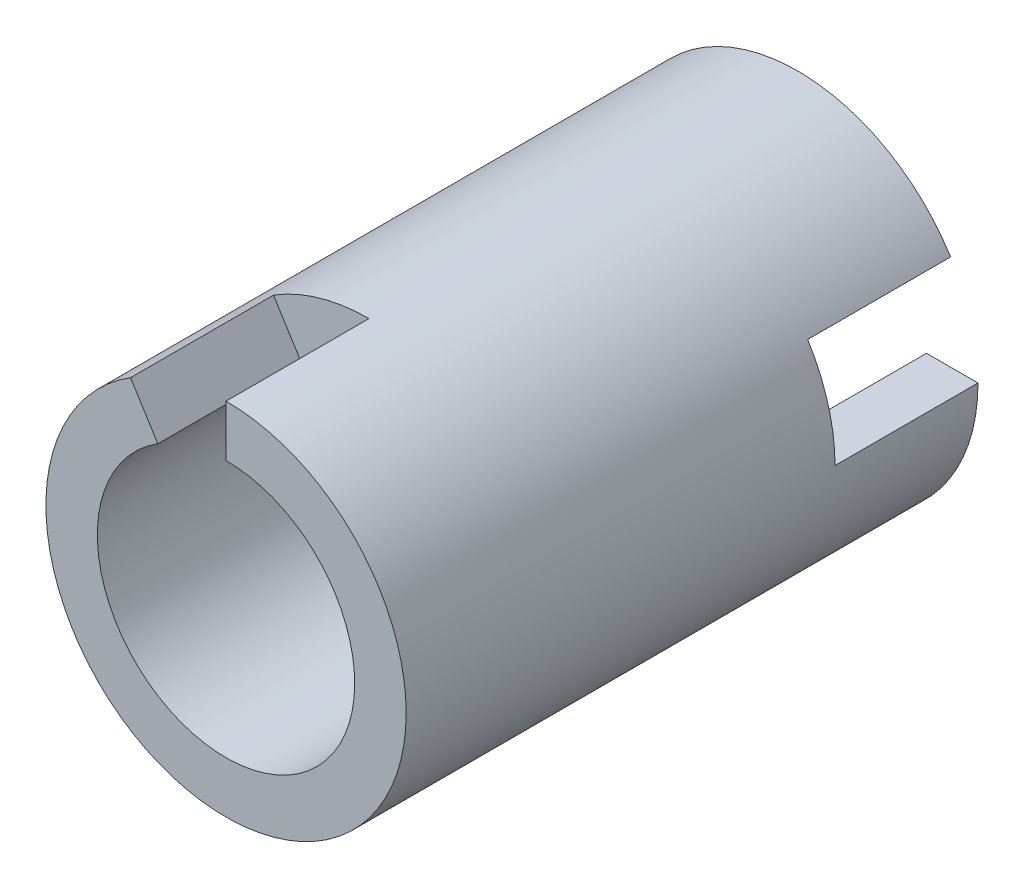
ISO-10303-21;
HEADER;
FILE_DESCRIPTION(('STEP AP214'),'2;1');
FILE_NAME('part.step','',(''),(''),'','','');
FILE_SCHEMA(('AUTOMOTIVE_DESIGN { 1 0 10303 214 1 1 1 1 }'));
ENDSEC;
DATA;
#1=APPLICATION_CONTEXT('core data for automotive mechanical design processes');
#2=APPLICATION_PROTOCOL_DEFINITION('international standard','automotive_design',2000,#1);
#3=PRODUCT_CONTEXT('',#1,'mechanical');
#4=PRODUCT('Part','Part','',(#3));
#5=PRODUCT_RELATED_PRODUCT_CATEGORY('part','',(#4));
#6=PRODUCT_DEFINITION_FORMATION('','',#4);
#7=PRODUCT_DEFINITION_CONTEXT('part definition',#1,'design');
#8=PRODUCT_DEFINITION('design','',#6,#7);
#9=PRODUCT_DEFINITION_SHAPE('','',#8);
#10=(LENGTH_UNIT() NAMED_UNIT(*) SI_UNIT(.MILLI.,.METRE.));
#11=(NAMED_UNIT(*) PLANE_ANGLE_UNIT() SI_UNIT($,.RADIAN.));
#12=(NAMED_UNIT(*) SI_UNIT($,.STERADIAN.) SOLID_ANGLE_UNIT());
#13=UNCERTAINTY_MEASURE_WITH_UNIT(LENGTH_MEASURE(1.E-05),#10,'distance_accuracy_value','');
#14=(GEOMETRIC_REPRESENTATION_CONTEXT(3) GLOBAL_UNCERTAINTY_ASSIGNED_CONTEXT((#13)) GLOBAL_UNIT_ASSIGNED_CONTEXT((#10,
#11,#12)) REPRESENTATION_CONTEXT('',''));
#15=CARTESIAN_POINT('',(0.,0.,0.));
#16=DIRECTION('',(0.,0.,1.));
#17=DIRECTION('',(1.,0.,0.));
#18=AXIS2_PLACEMENT_3D('',#15,#16,#17);
#19=CARTESIAN_POINT('',(0.,0.,-10.));
#20=DIRECTION('',(0.,0.,1.));
#21=DIRECTION('',(1.,0.,0.));
#22=AXIS2_PLACEMENT_3D('',#19,#20,#21);
#23=PLANE('',#22);
#24=DIRECTION('',(-0.848048096156435,-0.529919264233191,0.));
#25=VECTOR('',#24,1.);
#26=CARTESIAN_POINT('',(9.97014890227406,6.23004048300326,-10.));
#27=LINE('',#26,#25);
#28=CARTESIAN_POINT('',(5.34270300578554,3.3384913646691,-10.));
#29=VERTEX_POINT('',#28);
#30=CARTESIAN_POINT('',(3.81621643270396,2.38463668904936,-10.));
#31=VERTEX_POINT('',#30);
#32=EDGE_CURVE('E96',#29,#31,#27,.T.);
#33=ORIENTED_EDGE('',*,*,#32,.T.);
#34=CARTESIAN_POINT('',(0.,0.,-10.));
#35=DIRECTION('',(0.,0.,1.));
#36=DIRECTION('',(1.,0.,0.));
#37=AXIS2_PLACEMENT_3D('',#34,#35,#36);
#38=CIRCLE('',#37,4.5);
#39=CARTESIAN_POINT('',(4.5,0.,-10.));
#40=VERTEX_POINT('',#39);
#41=EDGE_CURVE('E138',#31,#40,#38,.T.);
#42=ORIENTED_EDGE('',*,*,#41,.T.);
#43=DIRECTION('',(1.,0.,0.));
#44=VECTOR('',#43,1.);
#45=CARTESIAN_POINT('',(0.,0.,-10.));
#46=LINE('',#45,#44);
#47=CARTESIAN_POINT('',(6.3,0.,-10.));
#48=VERTEX_POINT('',#47);
#49=EDGE_CURVE('E105',#40,#48,#46,.T.);
#50=ORIENTED_EDGE('',*,*,#49,.T.);
#51=CARTESIAN_POINT('',(0.,0.,-10.));
#52=DIRECTION('',(0.,0.,1.));
#53=DIRECTION('',(1.,0.,0.));
#54=AXIS2_PLACEMENT_3D('',#51,#52,#53);
#55=CIRCLE('',#54,6.3);
#56=EDGE_CURVE('E111',#29,#48,#55,.T.);
#57=ORIENTED_EDGE('',*,*,#56,.F.);
#58=EDGE_LOOP('',(#33,#42,#50,#57));
#59=FACE_BOUND('',#58,.T.);
#60=ADVANCED_FACE('F33',(#59),#23,.F.);
#61=CARTESIAN_POINT('',(0.,0.,-10.));
#62=DIRECTION('',(0.,0.,1.));
#63=DIRECTION('',(1.,0.,0.));
#64=AXIS2_PLACEMENT_3D('',#61,#62,#63);
#65=CYLINDRICAL_SURFACE('',#64,4.5);
#66=CARTESIAN_POINT('',(0.,0.,10.));
#67=DIRECTION('',(0.,0.,1.));
#68=DIRECTION('',(1.,0.,0.));
#69=AXIS2_PLACEMENT_3D('',#66,#67,#68);
#70=CIRCLE('',#69,4.5);
#71=CARTESIAN_POINT('',(-2.3846366890494,3.81621643270393,10.));
#72=VERTEX_POINT('',#71);
#73=CARTESIAN_POINT('',(0.,4.5,10.));
#74=VERTEX_POINT('',#73);
#75=EDGE_CURVE('E135',#72,#74,#70,.T.);
#76=ORIENTED_EDGE('',*,*,#75,.T.);
#77=DIRECTION('',(0.,0.,1.));
#78=VECTOR('',#77,1.);
#79=CARTESIAN_POINT('',(0.,4.5,-10.));
#80=LINE('',#79,#78);
#81=CARTESIAN_POINT('',(0.,4.5,5.));
#82=VERTEX_POINT('',#81);
#83=EDGE_CURVE('E132',#74,#82,#80,.F.);
#84=ORIENTED_EDGE('',*,*,#83,.T.);
#85=CARTESIAN_POINT('',(0.,0.,5.));
#86=DIRECTION('',(0.,0.,1.));
#87=DIRECTION('',(1.,0.,0.));
#88=AXIS2_PLACEMENT_3D('',#85,#86,#87);
#89=CIRCLE('',#88,4.5);
#90=CARTESIAN_POINT('',(-2.3846366890494,3.81621643270393,5.));
#91=VERTEX_POINT('',#90);
#92=EDGE_CURVE('E145',#91,#82,#89,.F.);
#93=ORIENTED_EDGE('',*,*,#92,.F.);
#94=DIRECTION('',(0.,0.,1.));
#95=VECTOR('',#94,1.);
#96=CARTESIAN_POINT('',(-2.3846366890494,3.81621643270393,-10.));
#97=LINE('',#96,#95);
#98=EDGE_CURVE('E129',#91,#72,#97,.T.);
#99=ORIENTED_EDGE('',*,*,#98,.T.);
#100=EDGE_LOOP('',(#76,#84,#93,#99));
#101=FACE_BOUND('',#100,.T.);
#102=DIRECTION('',(0.,0.,1.));
#103=VECTOR('',#102,1.);
#104=CARTESIAN_POINT('',(3.81621643270396,2.38463668904936,-10.));
#105=LINE('',#104,#103);
#106=CARTESIAN_POINT('',(3.81621643270396,2.38463668904936,-5.));
#107=VERTEX_POINT('',#106);
#108=EDGE_CURVE('E100',#107,#31,#105,.F.);
#109=ORIENTED_EDGE('',*,*,#108,.F.);
#110=CARTESIAN_POINT('',(0.,0.,-5.));
#111=DIRECTION('',(0.,0.,1.));
#112=DIRECTION('',(1.,0.,0.));
#113=AXIS2_PLACEMENT_3D('',#110,#111,#112);
#114=CIRCLE('',#113,4.5);
#115=CARTESIAN_POINT('',(4.5,0.,-5.));
#116=VERTEX_POINT('',#115);
#117=EDGE_CURVE('E157',#107,#116,#114,.F.);
#118=ORIENTED_EDGE('',*,*,#117,.T.);
#119=DIRECTION('',(0.,0.,1.));
#120=VECTOR('',#119,1.);
#121=CARTESIAN_POINT('',(4.5,0.,-10.));
#122=LINE('',#121,#120);
#123=EDGE_CURVE('E155',#40,#116,#122,.T.);
#124=ORIENTED_EDGE('',*,*,#123,.F.);
#125=ORIENTED_EDGE('',*,*,#41,.F.);
#126=EDGE_LOOP('',(#109,#118,#124,#125));
#127=FACE_BOUND('',#126,.T.);
#128=ADVANCED_FACE('F163',(#101,#127),#65,.F.);
#129=CARTESIAN_POINT('',(0.,0.,-10.));
#130=DIRECTION('',(0.,0.,1.));
#131=DIRECTION('',(1.,0.,0.));
#132=AXIS2_PLACEMENT_3D('',#129,#130,#131);
#133=CYLINDRICAL_SURFACE('',#132,6.3);
#134=DIRECTION('',(0.,0.,1.));
#135=VECTOR('',#134,1.);
#136=CARTESIAN_POINT('',(0.,6.3,-10.));
#137=LINE('',#136,#135);
#138=CARTESIAN_POINT('',(0.,6.3,5.));
#139=VERTEX_POINT('',#138);
#140=CARTESIAN_POINT('',(0.,6.3,10.));
#141=VERTEX_POINT('',#140);
#142=EDGE_CURVE('E117',#139,#141,#137,.T.);
#143=ORIENTED_EDGE('',*,*,#142,.T.);
#144=CARTESIAN_POINT('',(0.,0.,10.));
#145=DIRECTION('',(0.,0.,1.));
#146=DIRECTION('',(1.,0.,0.));
#147=AXIS2_PLACEMENT_3D('',#144,#145,#146);
#148=CIRCLE('',#147,6.3);
#149=CARTESIAN_POINT('',(-3.33849136466916,5.3427030057855,10.));
#150=VERTEX_POINT('',#149);
#151=EDGE_CURVE('E55',#150,#141,#148,.T.);
#152=ORIENTED_EDGE('',*,*,#151,.F.);
#153=DIRECTION('',(0.,0.,1.));
#154=VECTOR('',#153,1.);
#155=CARTESIAN_POINT('',(-3.33849136466916,5.3427030057855,-10.));
#156=LINE('',#155,#154);
#157=CARTESIAN_POINT('',(-3.33849136466916,5.3427030057855,5.));
#158=VERTEX_POINT('',#157);
#159=EDGE_CURVE('E147',#150,#158,#156,.F.);
#160=ORIENTED_EDGE('',*,*,#159,.T.);
#161=CARTESIAN_POINT('',(0.,0.,5.));
#162=DIRECTION('',(0.,0.,1.));
#163=DIRECTION('',(1.,0.,0.));
#164=AXIS2_PLACEMENT_3D('',#161,#162,#163);
#165=CIRCLE('',#164,6.3);
#166=EDGE_CURVE('E114',#139,#158,#165,.T.);
#167=ORIENTED_EDGE('',*,*,#166,.F.);
#168=EDGE_LOOP('',(#143,#152,#160,#167));
#169=FACE_BOUND('',#168,.T.);
#170=CARTESIAN_POINT('',(0.,0.,-5.));
#171=DIRECTION('',(0.,0.,1.));
#172=DIRECTION('',(1.,0.,0.));
#173=AXIS2_PLACEMENT_3D('',#170,#171,#172);
#174=CIRCLE('',#173,6.3);
#175=CARTESIAN_POINT('',(5.34270300578554,3.3384913646691,-5.));
#176=VERTEX_POINT('',#175);
#177=CARTESIAN_POINT('',(6.3,0.,-5.));
#178=VERTEX_POINT('',#177);
#179=EDGE_CURVE('E112',#176,#178,#174,.F.);
#180=ORIENTED_EDGE('',*,*,#179,.F.);
#181=DIRECTION('',(0.,0.,1.));
#182=VECTOR('',#181,1.);
#183=CARTESIAN_POINT('',(5.34270300578554,3.3384913646691,-10.));
#184=LINE('',#183,#182);
#185=EDGE_CURVE('E11',#176,#29,#184,.F.);
#186=ORIENTED_EDGE('',*,*,#185,.T.);
#187=ORIENTED_EDGE('',*,*,#56,.T.);
#188=DIRECTION('',(0.,0.,1.));
#189=VECTOR('',#188,1.);
#190=CARTESIAN_POINT('',(6.3,0.,-10.));
#191=LINE('',#190,#189);
#192=EDGE_CURVE('E40',#48,#178,#191,.T.);
#193=ORIENTED_EDGE('',*,*,#192,.T.);
#194=EDGE_LOOP('',(#180,#186,#187,#193));
#195=FACE_BOUND('',#194,.T.);
#196=ADVANCED_FACE('F109',(#169,#195),#133,.T.);
#197=CARTESIAN_POINT('',(0.,0.,10.));
#198=DIRECTION('',(0.,0.,1.));
#199=DIRECTION('',(1.,0.,0.));
#200=AXIS2_PLACEMENT_3D('',#197,#198,#199);
#201=PLANE('',#200);
#202=DIRECTION('',(0.5299192642332,-0.848048096156429,0.));
#203=VECTOR('',#202,1.);
#204=CARTESIAN_POINT('',(0.,0.,10.));
#205=LINE('',#204,#203);
#206=EDGE_CURVE('E140',#150,#72,#205,.T.);
#207=ORIENTED_EDGE('',*,*,#206,.F.);
#208=ORIENTED_EDGE('',*,*,#151,.T.);
#209=DIRECTION('',(0.,1.,0.));
#210=VECTOR('',#209,1.);
#211=CARTESIAN_POINT('',(0.,0.,10.));
#212=LINE('',#211,#210);
#213=EDGE_CURVE('E142',#74,#141,#212,.T.);
#214=ORIENTED_EDGE('',*,*,#213,.F.);
#215=ORIENTED_EDGE('',*,*,#75,.F.);
#216=EDGE_LOOP('',(#207,#208,#214,#215));
#217=FACE_BOUND('',#216,.T.);
#218=ADVANCED_FACE('F179',(#217),#201,.T.);
#219=CARTESIAN_POINT('',(0.,0.,5.));
#220=DIRECTION('',(0.,0.,1.));
#221=DIRECTION('',(1.,0.,0.));
#222=AXIS2_PLACEMENT_3D('',#219,#220,#221);
#223=PLANE('',#222);
#224=DIRECTION('',(0.,1.,0.));
#225=VECTOR('',#224,1.);
#226=CARTESIAN_POINT('',(0.,0.,5.));
#227=LINE('',#226,#225);
#228=EDGE_CURVE('E126',#82,#139,#227,.T.);
#229=ORIENTED_EDGE('',*,*,#228,.T.);
#230=ORIENTED_EDGE('',*,*,#166,.T.);
#231=DIRECTION('',(0.5299192642332,-0.848048096156429,0.));
#232=VECTOR('',#231,1.);
#233=CARTESIAN_POINT('',(-6.23004048300337,9.970148902274,5.));
#234=LINE('',#233,#232);
#235=EDGE_CURVE('E124',#158,#91,#234,.T.);
#236=ORIENTED_EDGE('',*,*,#235,.T.);
#237=ORIENTED_EDGE('',*,*,#92,.T.);
#238=EDGE_LOOP('',(#229,#230,#236,#237));
#239=FACE_BOUND('',#238,.T.);
#240=ADVANCED_FACE('F184',(#239),#223,.T.);
#241=CARTESIAN_POINT('',(0.,0.,5.));
#242=DIRECTION('',(1.,0.,0.));
#243=DIRECTION('',(0.,0.,-1.));
#244=AXIS2_PLACEMENT_3D('',#241,#242,#243);
#245=PLANE('',#244);
#246=ORIENTED_EDGE('',*,*,#142,.F.);
#247=ORIENTED_EDGE('',*,*,#228,.F.);
#248=ORIENTED_EDGE('',*,*,#83,.F.);
#249=ORIENTED_EDGE('',*,*,#213,.T.);
#250=EDGE_LOOP('',(#246,#247,#248,#249));
#251=FACE_BOUND('',#250,.T.);
#252=ADVANCED_FACE('F189',(#251),#245,.F.);
#253=CARTESIAN_POINT('',(-6.23004048300337,9.970148902274,5.));
#254=DIRECTION('',(-0.848048096156429,-0.5299192642332,0.));
#255=DIRECTION('',(0.5299192642332,-0.848048096156429,0.));
#256=AXIS2_PLACEMENT_3D('',#253,#254,#255);
#257=PLANE('',#256);
#258=ORIENTED_EDGE('',*,*,#159,.F.);
#259=ORIENTED_EDGE('',*,*,#206,.T.);
#260=ORIENTED_EDGE('',*,*,#98,.F.);
#261=ORIENTED_EDGE('',*,*,#235,.F.);
#262=EDGE_LOOP('',(#258,#259,#260,#261));
#263=FACE_BOUND('',#262,.T.);
#264=ADVANCED_FACE('F186',(#263),#257,.F.);
#265=CARTESIAN_POINT('',(9.97014890227406,6.23004048300326,-5.));
#266=DIRECTION('',(0.529919264233191,-0.848048096156435,0.));
#267=DIRECTION('',(0.848048096156435,0.529919264233191,0.));
#268=AXIS2_PLACEMENT_3D('',#265,#266,#267);
#269=PLANE('',#268);
#270=ORIENTED_EDGE('',*,*,#108,.T.);
#271=ORIENTED_EDGE('',*,*,#32,.F.);
#272=ORIENTED_EDGE('',*,*,#185,.F.);
#273=DIRECTION('',(-0.848048096156435,-0.529919264233191,0.));
#274=VECTOR('',#273,1.);
#275=CARTESIAN_POINT('',(9.97014890227406,6.23004048300326,-5.));
#276=LINE('',#275,#274);
#277=EDGE_CURVE('E47',#176,#107,#276,.T.);
#278=ORIENTED_EDGE('',*,*,#277,.T.);
#279=EDGE_LOOP('',(#270,#271,#272,#278));
#280=FACE_BOUND('',#279,.T.);
#281=ADVANCED_FACE('F97',(#280),#269,.T.);
#282=CARTESIAN_POINT('',(0.,0.,-5.));
#283=DIRECTION('',(0.,1.,0.));
#284=DIRECTION('',(-1.,0.,0.));
#285=AXIS2_PLACEMENT_3D('',#282,#283,#284);
#286=PLANE('',#285);
#287=ORIENTED_EDGE('',*,*,#123,.T.);
#288=DIRECTION('',(1.,0.,0.));
#289=VECTOR('',#288,1.);
#290=CARTESIAN_POINT('',(0.,0.,-5.));
#291=LINE('',#290,#289);
#292=EDGE_CURVE('E154',#116,#178,#291,.T.);
#293=ORIENTED_EDGE('',*,*,#292,.T.);
#294=ORIENTED_EDGE('',*,*,#192,.F.);
#295=ORIENTED_EDGE('',*,*,#49,.F.);
#296=EDGE_LOOP('',(#287,#293,#294,#295));
#297=FACE_BOUND('',#296,.T.);
#298=ADVANCED_FACE('F151',(#297),#286,.T.);
#299=CARTESIAN_POINT('',(0.,0.,-5.));
#300=DIRECTION('',(0.,0.,1.));
#301=DIRECTION('',(1.,0.,0.));
#302=AXIS2_PLACEMENT_3D('',#299,#300,#301);
#303=PLANE('',#302);
#304=ORIENTED_EDGE('',*,*,#277,.F.);
#305=ORIENTED_EDGE('',*,*,#179,.T.);
#306=ORIENTED_EDGE('',*,*,#292,.F.);
#307=ORIENTED_EDGE('',*,*,#117,.F.);
#308=EDGE_LOOP('',(#304,#305,#306,#307));
#309=FACE_BOUND('',#308,.T.);
#310=ADVANCED_FACE('F164',(#309),#303,.F.);
#311=CLOSED_SHELL('',(#60,#128,#196,#218,#240,#252,#264,#281,#298,#310));
#312=MANIFOLD_SOLID_BREP('B2',#311);
#313=ADVANCED_BREP_SHAPE_REPRESENTATION('',(#18,#312),#14);
#314=SHAPE_DEFINITION_REPRESENTATION(#9,#313);
ENDSEC;
END-ISO-10303-21;
